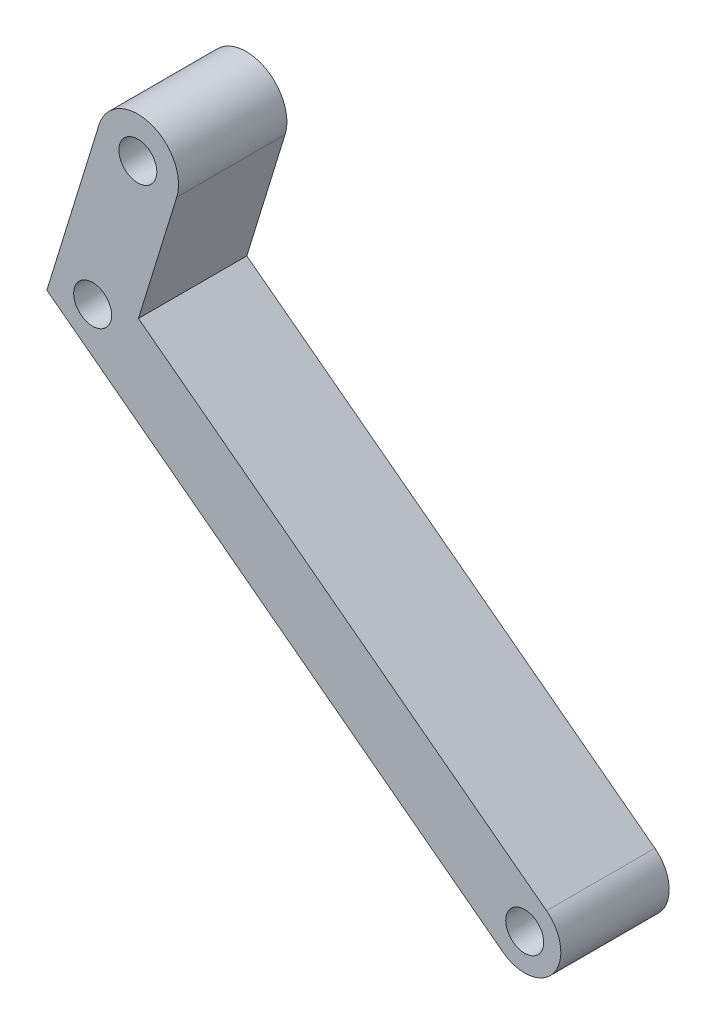
ISO-10303-21;
HEADER;
FILE_DESCRIPTION(('STEP AP214'),'2;1');
FILE_NAME('part.step','',(''),(''),'','','');
FILE_SCHEMA(('AUTOMOTIVE_DESIGN { 1 0 10303 214 1 1 1 1 }'));
ENDSEC;
DATA;
#1=APPLICATION_CONTEXT('core data for automotive mechanical design processes');
#2=APPLICATION_PROTOCOL_DEFINITION('international standard','automotive_design',2000,#1);
#3=PRODUCT_CONTEXT('',#1,'mechanical');
#4=PRODUCT('Part','Part','',(#3));
#5=PRODUCT_RELATED_PRODUCT_CATEGORY('part','',(#4));
#6=PRODUCT_DEFINITION_FORMATION('','',#4);
#7=PRODUCT_DEFINITION_CONTEXT('part definition',#1,'design');
#8=PRODUCT_DEFINITION('design','',#6,#7);
#9=PRODUCT_DEFINITION_SHAPE('','',#8);
#10=(LENGTH_UNIT() NAMED_UNIT(*) SI_UNIT(.MILLI.,.METRE.));
#11=(NAMED_UNIT(*) PLANE_ANGLE_UNIT() SI_UNIT($,.RADIAN.));
#12=(NAMED_UNIT(*) SI_UNIT($,.STERADIAN.) SOLID_ANGLE_UNIT());
#13=UNCERTAINTY_MEASURE_WITH_UNIT(LENGTH_MEASURE(1.E-05),#10,'distance_accuracy_value','');
#14=(GEOMETRIC_REPRESENTATION_CONTEXT(3) GLOBAL_UNCERTAINTY_ASSIGNED_CONTEXT((#13)) GLOBAL_UNIT_ASSIGNED_CONTEXT((#10,
#11,#12)) REPRESENTATION_CONTEXT('',''));
#15=CARTESIAN_POINT('',(0.,0.,0.));
#16=DIRECTION('',(0.,0.,1.));
#17=DIRECTION('',(1.,0.,0.));
#18=AXIS2_PLACEMENT_3D('',#15,#16,#17);
#19=CARTESIAN_POINT('',(79.9778556176607,-41.9265310012676,6.));
#20=DIRECTION('',(0.603512794504927,0.797353313700303,0.));
#21=DIRECTION('',(-0.797353313700303,0.603512794504927,0.));
#22=AXIS2_PLACEMENT_3D('',#19,#20,#21);
#23=PLANE('',#22);
#24=DIRECTION('',(0.797353313700303,-0.603512794504927,0.));
#25=VECTOR('',#24,1.);
#26=CARTESIAN_POINT('',(79.9778556176607,-41.9265310012676,0.));
#27=LINE('',#26,#25);
#28=CARTESIAN_POINT('',(54.7284991866002,-22.8154175245538,0.));
#29=VERTEX_POINT('',#28);
#30=CARTESIAN_POINT('',(79.9778556176607,-41.9265310012676,0.));
#31=VERTEX_POINT('',#30);
#32=EDGE_CURVE('E122',#29,#31,#27,.T.);
#33=ORIENTED_EDGE('',*,*,#32,.T.);
#34=DIRECTION('',(0.,0.,-1.));
#35=VECTOR('',#34,1.);
#36=CARTESIAN_POINT('',(79.9778556176607,-41.9265310012676,6.));
#37=LINE('',#36,#35);
#38=CARTESIAN_POINT('',(79.9778556176607,-41.9265310012676,6.));
#39=VERTEX_POINT('',#38);
#40=EDGE_CURVE('E11',#39,#31,#37,.T.);
#41=ORIENTED_EDGE('',*,*,#40,.F.);
#42=DIRECTION('',(0.797353313700303,-0.603512794504927,0.));
#43=VECTOR('',#42,1.);
#44=CARTESIAN_POINT('',(79.9778556176607,-41.9265310012676,6.));
#45=LINE('',#44,#43);
#46=CARTESIAN_POINT('',(54.7284991866002,-22.8154175245538,6.));
#47=VERTEX_POINT('',#46);
#48=EDGE_CURVE('E133',#47,#39,#45,.T.);
#49=ORIENTED_EDGE('',*,*,#48,.F.);
#50=DIRECTION('',(0.,0.,-1.));
#51=VECTOR('',#50,1.);
#52=CARTESIAN_POINT('',(54.7284991866002,-22.8154175245538,6.));
#53=LINE('',#52,#51);
#54=EDGE_CURVE('E118',#47,#29,#53,.T.);
#55=ORIENTED_EDGE('',*,*,#54,.T.);
#56=EDGE_LOOP('',(#33,#41,#49,#55));
#57=FACE_BOUND('',#56,.T.);
#58=ADVANCED_FACE('F36',(#57),#23,.F.);
#59=CARTESIAN_POINT('',(81.1848812066705,-40.331824373867,6.));
#60=DIRECTION('',(0.,0.,-1.));
#61=DIRECTION('',(-1.,0.,0.));
#62=AXIS2_PLACEMENT_3D('',#59,#60,#61);
#63=CYLINDRICAL_SURFACE('',#62,1.99999999999999);
#64=CARTESIAN_POINT('',(81.1848812066705,-40.331824373867,0.));
#65=DIRECTION('',(0.,0.,1.));
#66=DIRECTION('',(-1.,0.,0.));
#67=AXIS2_PLACEMENT_3D('',#64,#65,#66);
#68=CIRCLE('',#67,1.99999999999999);
#69=CARTESIAN_POINT('',(82.3919067956804,-38.7371177464664,0.));
#70=VERTEX_POINT('',#69);
#71=EDGE_CURVE('E125',#31,#70,#68,.T.);
#72=ORIENTED_EDGE('',*,*,#71,.T.);
#73=DIRECTION('',(0.,0.,-1.));
#74=VECTOR('',#73,1.);
#75=CARTESIAN_POINT('',(82.3919067956804,-38.7371177464664,6.));
#76=LINE('',#75,#74);
#77=CARTESIAN_POINT('',(82.3919067956804,-38.7371177464664,6.));
#78=VERTEX_POINT('',#77);
#79=EDGE_CURVE('E45',#78,#70,#76,.T.);
#80=ORIENTED_EDGE('',*,*,#79,.F.);
#81=CARTESIAN_POINT('',(81.1848812066705,-40.331824373867,6.));
#82=DIRECTION('',(0.,0.,1.));
#83=DIRECTION('',(-1.,0.,0.));
#84=AXIS2_PLACEMENT_3D('',#81,#82,#83);
#85=CIRCLE('',#84,1.99999999999999);
#86=EDGE_CURVE('E91',#39,#78,#85,.T.);
#87=ORIENTED_EDGE('',*,*,#86,.F.);
#88=ORIENTED_EDGE('',*,*,#40,.T.);
#89=EDGE_LOOP('',(#72,#80,#87,#88));
#90=FACE_BOUND('',#89,.T.);
#91=ADVANCED_FACE('F159',(#90),#63,.T.);
#92=CARTESIAN_POINT('',(59.8000644047227,-21.6374635528846,6.));
#93=DIRECTION('',(-0.603512794504927,-0.797353313700303,0.));
#94=DIRECTION('',(0.797353313700303,-0.603512794504927,0.));
#95=AXIS2_PLACEMENT_3D('',#92,#93,#94);
#96=PLANE('',#95);
#97=DIRECTION('',(-0.797353313700303,0.603512794504927,0.));
#98=VECTOR('',#97,1.);
#99=CARTESIAN_POINT('',(59.8000644047227,-21.6374635528846,0.));
#100=LINE('',#99,#98);
#101=CARTESIAN_POINT('',(59.8000644047227,-21.6374635528846,0.));
#102=VERTEX_POINT('',#101);
#103=EDGE_CURVE('E128',#70,#102,#100,.T.);
#104=ORIENTED_EDGE('',*,*,#103,.T.);
#105=DIRECTION('',(0.,0.,-1.));
#106=VECTOR('',#105,1.);
#107=CARTESIAN_POINT('',(59.8000644047227,-21.6374635528846,6.));
#108=LINE('',#107,#106);
#109=CARTESIAN_POINT('',(59.8000644047227,-21.6374635528846,6.));
#110=VERTEX_POINT('',#109);
#111=EDGE_CURVE('E113',#110,#102,#108,.T.);
#112=ORIENTED_EDGE('',*,*,#111,.F.);
#113=DIRECTION('',(-0.797353313700303,0.603512794504927,0.));
#114=VECTOR('',#113,1.);
#115=CARTESIAN_POINT('',(59.8000644047227,-21.6374635528846,6.));
#116=LINE('',#115,#114);
#117=EDGE_CURVE('E104',#78,#110,#116,.T.);
#118=ORIENTED_EDGE('',*,*,#117,.F.);
#119=ORIENTED_EDGE('',*,*,#79,.T.);
#120=EDGE_LOOP('',(#104,#112,#118,#119));
#121=FACE_BOUND('',#120,.T.);
#122=ADVANCED_FACE('F162',(#121),#96,.F.);
#123=CARTESIAN_POINT('',(61.9170108618409,-14.7655684558639,6.));
#124=DIRECTION('',(-0.955680557518818,0.294405624913184,0.));
#125=DIRECTION('',(-0.294405624913184,-0.955680557518818,0.));
#126=AXIS2_PLACEMENT_3D('',#123,#124,#125);
#127=PLANE('',#126);
#128=DIRECTION('',(0.294405624913183,0.955680557518818,0.));
#129=VECTOR('',#128,1.);
#130=CARTESIAN_POINT('',(61.9170108618409,-14.7655684558639,0.));
#131=LINE('',#130,#129);
#132=CARTESIAN_POINT('',(61.9170108618409,-14.7655684558639,0.));
#133=VERTEX_POINT('',#132);
#134=EDGE_CURVE('E112',#102,#133,#131,.T.);
#135=ORIENTED_EDGE('',*,*,#134,.T.);
#136=DIRECTION('',(0.,0.,-1.));
#137=VECTOR('',#136,1.);
#138=CARTESIAN_POINT('',(61.9170108618409,-14.7655684558639,6.));
#139=LINE('',#138,#137);
#140=CARTESIAN_POINT('',(61.9170108618409,-14.7655684558639,6.));
#141=VERTEX_POINT('',#140);
#142=EDGE_CURVE('E109',#141,#133,#139,.T.);
#143=ORIENTED_EDGE('',*,*,#142,.F.);
#144=DIRECTION('',(0.294405624913183,0.955680557518818,0.));
#145=VECTOR('',#144,1.);
#146=CARTESIAN_POINT('',(61.9170108618409,-14.7655684558639,6.));
#147=LINE('',#146,#145);
#148=EDGE_CURVE('E98',#110,#141,#147,.T.);
#149=ORIENTED_EDGE('',*,*,#148,.F.);
#150=ORIENTED_EDGE('',*,*,#111,.T.);
#151=EDGE_LOOP('',(#135,#143,#149,#150));
#152=FACE_BOUND('',#151,.T.);
#153=ADVANCED_FACE('F110',(#152),#127,.F.);
#154=CARTESIAN_POINT('',(59.7667296074235,-14.1031557998092,6.));
#155=DIRECTION('',(0.,0.,-1.));
#156=DIRECTION('',(-1.,0.,0.));
#157=AXIS2_PLACEMENT_3D('',#154,#155,#156);
#158=CYLINDRICAL_SURFACE('',#157,2.25000000000002);
#159=CARTESIAN_POINT('',(59.7667296074235,-14.1031557998092,0.));
#160=DIRECTION('',(0.,0.,1.));
#161=DIRECTION('',(-1.,0.,0.));
#162=AXIS2_PLACEMENT_3D('',#159,#160,#161);
#163=CIRCLE('',#162,2.25000000000002);
#164=CARTESIAN_POINT('',(57.6164483530062,-13.4407431437545,0.));
#165=VERTEX_POINT('',#164);
#166=EDGE_CURVE('E77',#133,#165,#163,.T.);
#167=ORIENTED_EDGE('',*,*,#166,.T.);
#168=DIRECTION('',(0.,0.,-1.));
#169=VECTOR('',#168,1.);
#170=CARTESIAN_POINT('',(57.6164483530062,-13.4407431437545,6.));
#171=LINE('',#170,#169);
#172=CARTESIAN_POINT('',(57.6164483530062,-13.4407431437545,6.));
#173=VERTEX_POINT('',#172);
#174=EDGE_CURVE('E114',#173,#165,#171,.T.);
#175=ORIENTED_EDGE('',*,*,#174,.F.);
#176=CARTESIAN_POINT('',(59.7667296074235,-14.1031557998092,6.));
#177=DIRECTION('',(0.,0.,1.));
#178=DIRECTION('',(-1.,0.,0.));
#179=AXIS2_PLACEMENT_3D('',#176,#177,#178);
#180=CIRCLE('',#179,2.25000000000002);
#181=EDGE_CURVE('E102',#141,#173,#180,.T.);
#182=ORIENTED_EDGE('',*,*,#181,.F.);
#183=ORIENTED_EDGE('',*,*,#142,.T.);
#184=EDGE_LOOP('',(#167,#175,#182,#183));
#185=FACE_BOUND('',#184,.T.);
#186=ADVANCED_FACE('F116',(#185),#158,.T.);
#187=CARTESIAN_POINT('',(54.7284991866002,-22.8154175245538,6.));
#188=DIRECTION('',(0.955680557518818,-0.294405624913183,0.));
#189=DIRECTION('',(0.294405624913183,0.955680557518818,0.));
#190=AXIS2_PLACEMENT_3D('',#187,#188,#189);
#191=PLANE('',#190);
#192=DIRECTION('',(-0.294405624913183,-0.955680557518818,0.));
#193=VECTOR('',#192,1.);
#194=CARTESIAN_POINT('',(54.7284991866002,-22.8154175245538,0.));
#195=LINE('',#194,#193);
#196=EDGE_CURVE('E83',#165,#29,#195,.T.);
#197=ORIENTED_EDGE('',*,*,#196,.T.);
#198=ORIENTED_EDGE('',*,*,#54,.F.);
#199=DIRECTION('',(-0.294405624913183,-0.955680557518818,0.));
#200=VECTOR('',#199,1.);
#201=CARTESIAN_POINT('',(54.7284991866002,-22.8154175245538,6.));
#202=LINE('',#201,#200);
#203=EDGE_CURVE('E54',#173,#47,#202,.T.);
#204=ORIENTED_EDGE('',*,*,#203,.F.);
#205=ORIENTED_EDGE('',*,*,#174,.T.);
#206=EDGE_LOOP('',(#197,#198,#204,#205));
#207=FACE_BOUND('',#206,.T.);
#208=ADVANCED_FACE('F167',(#207),#191,.F.);
#209=CARTESIAN_POINT('',(59.7667296074235,-14.1031557998092,6.));
#210=DIRECTION('',(0.,0.,-1.));
#211=DIRECTION('',(-1.,0.,0.));
#212=AXIS2_PLACEMENT_3D('',#209,#210,#211);
#213=PLANE('',#212);
#214=CARTESIAN_POINT('',(59.7667296074235,-14.1031557998092,6.));
#215=DIRECTION('',(0.,0.,-1.));
#216=DIRECTION('',(-1.,0.,0.));
#217=AXIS2_PLACEMENT_3D('',#214,#215,#216);
#218=CIRCLE('',#217,1.05);
#219=CARTESIAN_POINT('',(58.7167296074235,-14.1031557998092,6.));
#220=VERTEX_POINT('',#219);
#221=EDGE_CURVE('E126',#220,#220,#218,.T.);
#222=ORIENTED_EDGE('',*,*,#221,.T.);
#223=EDGE_LOOP('',(#222));
#224=FACE_BOUND('',#223,.T.);
#225=CARTESIAN_POINT('',(57.2642817956615,-22.2264405387192,6.));
#226=DIRECTION('',(0.,0.,-1.));
#227=DIRECTION('',(-1.,0.,0.));
#228=AXIS2_PLACEMENT_3D('',#225,#226,#227);
#229=CIRCLE('',#228,1.05);
#230=CARTESIAN_POINT('',(56.2142817956615,-22.2264405387192,6.));
#231=VERTEX_POINT('',#230);
#232=EDGE_CURVE('E144',#231,#231,#229,.T.);
#233=ORIENTED_EDGE('',*,*,#232,.T.);
#234=EDGE_LOOP('',(#233));
#235=FACE_BOUND('',#234,.T.);
#236=CARTESIAN_POINT('',(81.1848812066705,-40.331824373867,6.));
#237=DIRECTION('',(0.,0.,-1.));
#238=DIRECTION('',(-1.,0.,0.));
#239=AXIS2_PLACEMENT_3D('',#236,#237,#238);
#240=CIRCLE('',#239,1.04999999999999);
#241=CARTESIAN_POINT('',(80.1348812066705,-40.331824373867,6.));
#242=VERTEX_POINT('',#241);
#243=EDGE_CURVE('E141',#242,#242,#240,.T.);
#244=ORIENTED_EDGE('',*,*,#243,.T.);
#245=EDGE_LOOP('',(#244));
#246=FACE_BOUND('',#245,.T.);
#247=ORIENTED_EDGE('',*,*,#48,.T.);
#248=ORIENTED_EDGE('',*,*,#86,.T.);
#249=ORIENTED_EDGE('',*,*,#117,.T.);
#250=ORIENTED_EDGE('',*,*,#148,.T.);
#251=ORIENTED_EDGE('',*,*,#181,.T.);
#252=ORIENTED_EDGE('',*,*,#203,.T.);
#253=EDGE_LOOP('',(#247,#248,#249,#250,#251,#252));
#254=FACE_BOUND('',#253,.T.);
#255=ADVANCED_FACE('F100',(#224,#235,#246,#254),#213,.F.);
#256=CARTESIAN_POINT('',(59.7667296074235,-14.1031557998092,0.));
#257=DIRECTION('',(0.,0.,-1.));
#258=DIRECTION('',(-1.,0.,0.));
#259=AXIS2_PLACEMENT_3D('',#256,#257,#258);
#260=PLANE('',#259);
#261=CARTESIAN_POINT('',(59.7667296074235,-14.1031557998092,0.));
#262=DIRECTION('',(0.,0.,-1.));
#263=DIRECTION('',(-1.,0.,0.));
#264=AXIS2_PLACEMENT_3D('',#261,#262,#263);
#265=CIRCLE('',#264,1.05);
#266=CARTESIAN_POINT('',(58.7167296074235,-14.1031557998092,0.));
#267=VERTEX_POINT('',#266);
#268=EDGE_CURVE('E39',#267,#267,#265,.T.);
#269=ORIENTED_EDGE('',*,*,#268,.F.);
#270=EDGE_LOOP('',(#269));
#271=FACE_BOUND('',#270,.T.);
#272=CARTESIAN_POINT('',(57.2642817956615,-22.2264405387192,0.));
#273=DIRECTION('',(0.,0.,-1.));
#274=DIRECTION('',(-1.,0.,0.));
#275=AXIS2_PLACEMENT_3D('',#272,#273,#274);
#276=CIRCLE('',#275,1.05);
#277=CARTESIAN_POINT('',(56.2142817956615,-22.2264405387192,0.));
#278=VERTEX_POINT('',#277);
#279=EDGE_CURVE('E142',#278,#278,#276,.T.);
#280=ORIENTED_EDGE('',*,*,#279,.F.);
#281=EDGE_LOOP('',(#280));
#282=FACE_BOUND('',#281,.T.);
#283=CARTESIAN_POINT('',(81.1848812066705,-40.331824373867,0.));
#284=DIRECTION('',(0.,0.,-1.));
#285=DIRECTION('',(-1.,0.,0.));
#286=AXIS2_PLACEMENT_3D('',#283,#284,#285);
#287=CIRCLE('',#286,1.04999999999999);
#288=CARTESIAN_POINT('',(80.1348812066705,-40.331824373867,0.));
#289=VERTEX_POINT('',#288);
#290=EDGE_CURVE('E139',#289,#289,#287,.T.);
#291=ORIENTED_EDGE('',*,*,#290,.F.);
#292=EDGE_LOOP('',(#291));
#293=FACE_BOUND('',#292,.T.);
#294=ORIENTED_EDGE('',*,*,#32,.F.);
#295=ORIENTED_EDGE('',*,*,#196,.F.);
#296=ORIENTED_EDGE('',*,*,#166,.F.);
#297=ORIENTED_EDGE('',*,*,#134,.F.);
#298=ORIENTED_EDGE('',*,*,#103,.F.);
#299=ORIENTED_EDGE('',*,*,#71,.F.);
#300=EDGE_LOOP('',(#294,#295,#296,#297,#298,#299));
#301=FACE_BOUND('',#300,.T.);
#302=ADVANCED_FACE('F165',(#271,#282,#293,#301),#260,.T.);
#303=CARTESIAN_POINT('',(81.1848812066705,-40.331824373867,-11.));
#304=DIRECTION('',(0.,0.,1.));
#305=DIRECTION('',(1.,0.,0.));
#306=AXIS2_PLACEMENT_3D('',#303,#304,#305);
#307=CYLINDRICAL_SURFACE('',#306,1.04999999999999);
#308=ORIENTED_EDGE('',*,*,#290,.T.);
#309=EDGE_LOOP('',(#308));
#310=FACE_BOUND('',#309,.T.);
#311=ORIENTED_EDGE('',*,*,#243,.F.);
#312=EDGE_LOOP('',(#311));
#313=FACE_BOUND('',#312,.T.);
#314=ADVANCED_FACE('F218',(#310,#313),#307,.F.);
#315=CARTESIAN_POINT('',(57.2642817956615,-22.2264405387192,-11.));
#316=DIRECTION('',(0.,0.,1.));
#317=DIRECTION('',(1.,0.,0.));
#318=AXIS2_PLACEMENT_3D('',#315,#316,#317);
#319=CYLINDRICAL_SURFACE('',#318,1.05);
#320=ORIENTED_EDGE('',*,*,#279,.T.);
#321=EDGE_LOOP('',(#320));
#322=FACE_BOUND('',#321,.T.);
#323=ORIENTED_EDGE('',*,*,#232,.F.);
#324=EDGE_LOOP('',(#323));
#325=FACE_BOUND('',#324,.T.);
#326=ADVANCED_FACE('F227',(#322,#325),#319,.F.);
#327=CARTESIAN_POINT('',(59.7667296074235,-14.1031557998092,-11.));
#328=DIRECTION('',(0.,0.,1.));
#329=DIRECTION('',(1.,0.,0.));
#330=AXIS2_PLACEMENT_3D('',#327,#328,#329);
#331=CYLINDRICAL_SURFACE('',#330,1.05);
#332=ORIENTED_EDGE('',*,*,#268,.T.);
#333=EDGE_LOOP('',(#332));
#334=FACE_BOUND('',#333,.T.);
#335=ORIENTED_EDGE('',*,*,#221,.F.);
#336=EDGE_LOOP('',(#335));
#337=FACE_BOUND('',#336,.T.);
#338=ADVANCED_FACE('F237',(#334,#337),#331,.F.);
#339=CLOSED_SHELL('',(#58,#91,#122,#153,#186,#208,#255,#302,#314,#326,#338));
#340=MANIFOLD_SOLID_BREP('B2',#339);
#341=ADVANCED_BREP_SHAPE_REPRESENTATION('',(#18,#340),#14);
#342=SHAPE_DEFINITION_REPRESENTATION(#9,#341);
ENDSEC;
END-ISO-10303-21;
